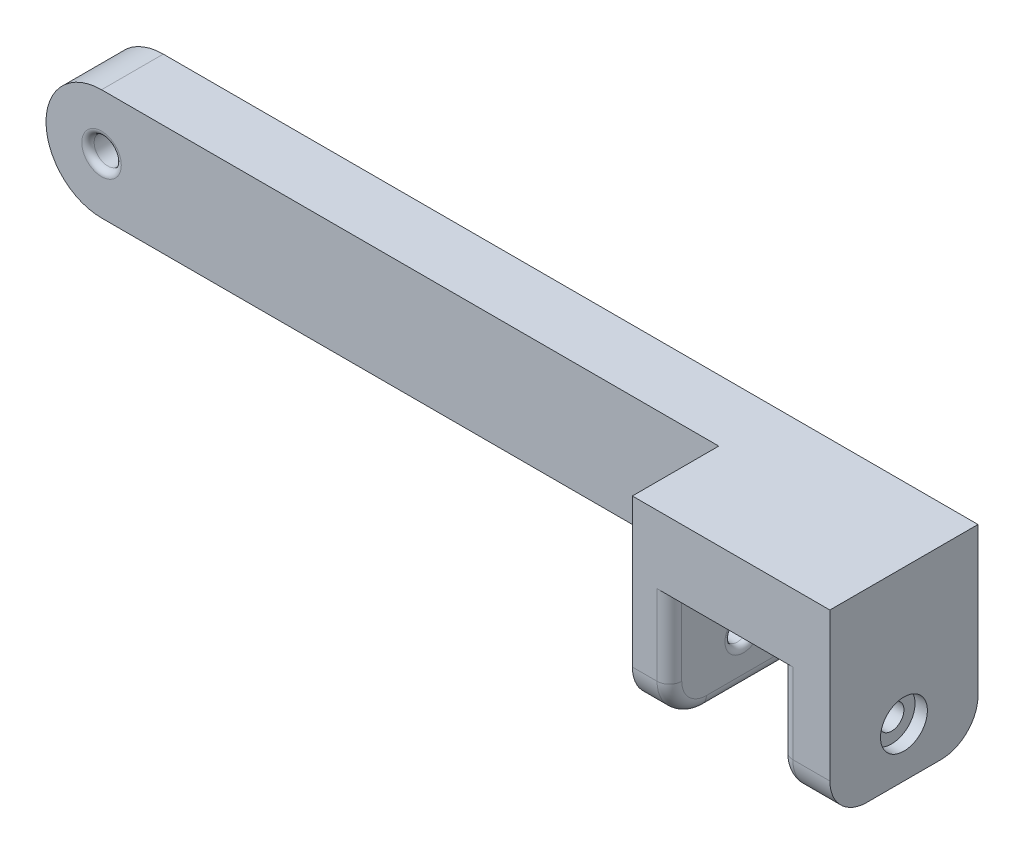
ISO-10303-21;
HEADER;
FILE_DESCRIPTION(('STEP AP214'),'2;1');
FILE_NAME('part.step','',(''),(''),'','','');
FILE_SCHEMA(('AUTOMOTIVE_DESIGN { 1 0 10303 214 1 1 1 1 }'));
ENDSEC;
DATA;
#1=APPLICATION_CONTEXT('core data for automotive mechanical design processes');
#2=APPLICATION_PROTOCOL_DEFINITION('international standard','automotive_design',2000,#1);
#3=PRODUCT_CONTEXT('',#1,'mechanical');
#4=PRODUCT('Part','Part','',(#3));
#5=PRODUCT_RELATED_PRODUCT_CATEGORY('part','',(#4));
#6=PRODUCT_DEFINITION_FORMATION('','',#4);
#7=PRODUCT_DEFINITION_CONTEXT('part definition',#1,'design');
#8=PRODUCT_DEFINITION('design','',#6,#7);
#9=PRODUCT_DEFINITION_SHAPE('','',#8);
#10=(LENGTH_UNIT() NAMED_UNIT(*) SI_UNIT(.MILLI.,.METRE.));
#11=(NAMED_UNIT(*) PLANE_ANGLE_UNIT() SI_UNIT($,.RADIAN.));
#12=(NAMED_UNIT(*) SI_UNIT($,.STERADIAN.) SOLID_ANGLE_UNIT());
#13=UNCERTAINTY_MEASURE_WITH_UNIT(LENGTH_MEASURE(1.E-05),#10,'distance_accuracy_value','');
#14=(GEOMETRIC_REPRESENTATION_CONTEXT(3) GLOBAL_UNCERTAINTY_ASSIGNED_CONTEXT((#13)) GLOBAL_UNIT_ASSIGNED_CONTEXT((#10,
#11,#12)) REPRESENTATION_CONTEXT('',''));
#15=CARTESIAN_POINT('',(0.,0.,0.));
#16=DIRECTION('',(0.,0.,1.));
#17=DIRECTION('',(1.,0.,0.));
#18=AXIS2_PLACEMENT_3D('',#15,#16,#17);
#19=CARTESIAN_POINT('',(62.,-10.5,-3.5));
#20=DIRECTION('',(1.,0.,0.));
#21=DIRECTION('',(0.,0.,-1.));
#22=AXIS2_PLACEMENT_3D('',#19,#20,#21);
#23=PLANE('',#22);
#24=CARTESIAN_POINT('',(62.,-6.5,6.));
#25=DIRECTION('',(1.,0.,0.));
#26=DIRECTION('',(0.,0.,-1.));
#27=AXIS2_PLACEMENT_3D('',#24,#25,#26);
#28=CIRCLE('',#27,1.);
#29=CARTESIAN_POINT('',(62.,-6.5,5.));
#30=VERTEX_POINT('',#29);
#31=EDGE_CURVE('E264',#30,#30,#28,.T.);
#32=ORIENTED_EDGE('',*,*,#31,.T.);
#33=EDGE_LOOP('',(#32));
#34=FACE_BOUND('',#33,.T.);
#35=CARTESIAN_POINT('',(62.,-7.5,9.));
#36=DIRECTION('',(1.,0.,0.));
#37=DIRECTION('',(0.,0.,-1.));
#38=AXIS2_PLACEMENT_3D('',#35,#36,#37);
#39=CIRCLE('',#38,2.);
#40=CARTESIAN_POINT('',(62.,-7.5,11.));
#41=VERTEX_POINT('',#40);
#42=CARTESIAN_POINT('',(62.,-9.5,9.));
#43=VERTEX_POINT('',#42);
#44=EDGE_CURVE('E333',#41,#43,#39,.T.);
#45=ORIENTED_EDGE('',*,*,#44,.F.);
#46=DIRECTION('',(0.,1.,0.));
#47=VECTOR('',#46,1.);
#48=CARTESIAN_POINT('',(62.,-1.,11.));
#49=LINE('',#48,#47);
#50=CARTESIAN_POINT('',(62.,-1.,11.));
#51=VERTEX_POINT('',#50);
#52=EDGE_CURVE('E271',#41,#51,#49,.T.);
#53=ORIENTED_EDGE('',*,*,#52,.T.);
#54=DIRECTION('',(0.,0.,-1.));
#55=VECTOR('',#54,1.);
#56=CARTESIAN_POINT('',(62.,-1.,-3.5));
#57=LINE('',#56,#55);
#58=CARTESIAN_POINT('',(62.,-1.,1.));
#59=VERTEX_POINT('',#58);
#60=EDGE_CURVE('E568',#51,#59,#57,.T.);
#61=ORIENTED_EDGE('',*,*,#60,.T.);
#62=DIRECTION('',(0.,1.,0.));
#63=VECTOR('',#62,1.);
#64=CARTESIAN_POINT('',(62.,-10.5,1.));
#65=LINE('',#64,#63);
#66=CARTESIAN_POINT('',(62.,-7.5,1.));
#67=VERTEX_POINT('',#66);
#68=EDGE_CURVE('E268',#59,#67,#65,.F.);
#69=ORIENTED_EDGE('',*,*,#68,.T.);
#70=CARTESIAN_POINT('',(62.,-7.5,3.));
#71=DIRECTION('',(1.,0.,0.));
#72=DIRECTION('',(0.,0.,-1.));
#73=AXIS2_PLACEMENT_3D('',#70,#71,#72);
#74=CIRCLE('',#73,2.);
#75=CARTESIAN_POINT('',(62.,-9.5,3.));
#76=VERTEX_POINT('',#75);
#77=EDGE_CURVE('E331',#76,#67,#74,.T.);
#78=ORIENTED_EDGE('',*,*,#77,.F.);
#79=DIRECTION('',(0.,0.,-1.));
#80=VECTOR('',#79,1.);
#81=CARTESIAN_POINT('',(62.,-9.5,-3.5));
#82=LINE('',#81,#80);
#83=EDGE_CURVE('E260',#76,#43,#82,.F.);
#84=ORIENTED_EDGE('',*,*,#83,.T.);
#85=EDGE_LOOP('',(#45,#53,#61,#69,#78,#84));
#86=FACE_BOUND('',#85,.T.);
#87=ADVANCED_FACE('F39',(#34,#86),#23,.F.);
#88=CARTESIAN_POINT('',(53.,-10.5,-3.5));
#89=DIRECTION('',(-1.,0.,0.));
#90=DIRECTION('',(0.,0.,1.));
#91=AXIS2_PLACEMENT_3D('',#88,#89,#90);
#92=PLANE('',#91);
#93=CARTESIAN_POINT('',(53.,-6.5,6.));
#94=DIRECTION('',(-1.,0.,0.));
#95=DIRECTION('',(0.,0.,1.));
#96=AXIS2_PLACEMENT_3D('',#93,#94,#95);
#97=CIRCLE('',#96,1.5);
#98=CARTESIAN_POINT('',(53.,-6.5,7.5));
#99=VERTEX_POINT('',#98);
#100=EDGE_CURVE('E245',#99,#99,#97,.T.);
#101=ORIENTED_EDGE('',*,*,#100,.T.);
#102=EDGE_LOOP('',(#101));
#103=FACE_BOUND('',#102,.T.);
#104=CARTESIAN_POINT('',(53.,-7.5,3.));
#105=DIRECTION('',(-1.,0.,0.));
#106=DIRECTION('',(0.,0.,1.));
#107=AXIS2_PLACEMENT_3D('',#104,#105,#106);
#108=CIRCLE('',#107,2.);
#109=CARTESIAN_POINT('',(53.,-7.5,1.));
#110=VERTEX_POINT('',#109);
#111=CARTESIAN_POINT('',(53.,-9.5,3.));
#112=VERTEX_POINT('',#111);
#113=EDGE_CURVE('E317',#110,#112,#108,.T.);
#114=ORIENTED_EDGE('',*,*,#113,.F.);
#115=DIRECTION('',(0.,-1.,0.));
#116=VECTOR('',#115,1.);
#117=CARTESIAN_POINT('',(53.,-10.5,1.));
#118=LINE('',#117,#116);
#119=CARTESIAN_POINT('',(53.,-1.,1.));
#120=VERTEX_POINT('',#119);
#121=EDGE_CURVE('E289',#110,#120,#118,.F.);
#122=ORIENTED_EDGE('',*,*,#121,.T.);
#123=DIRECTION('',(0.,0.,1.));
#124=VECTOR('',#123,1.);
#125=CARTESIAN_POINT('',(53.,-1.,-3.5));
#126=LINE('',#125,#124);
#127=CARTESIAN_POINT('',(53.,-1.,11.));
#128=VERTEX_POINT('',#127);
#129=EDGE_CURVE('E566',#120,#128,#126,.T.);
#130=ORIENTED_EDGE('',*,*,#129,.T.);
#131=DIRECTION('',(0.,1.,0.));
#132=VECTOR('',#131,1.);
#133=CARTESIAN_POINT('',(53.,-10.5,11.));
#134=LINE('',#133,#132);
#135=CARTESIAN_POINT('',(53.,-7.5,11.));
#136=VERTEX_POINT('',#135);
#137=EDGE_CURVE('E291',#128,#136,#134,.F.);
#138=ORIENTED_EDGE('',*,*,#137,.T.);
#139=CARTESIAN_POINT('',(53.,-7.5,9.));
#140=DIRECTION('',(-1.,0.,0.));
#141=DIRECTION('',(0.,0.,1.));
#142=AXIS2_PLACEMENT_3D('',#139,#140,#141);
#143=CIRCLE('',#142,2.);
#144=CARTESIAN_POINT('',(53.,-9.5,9.));
#145=VERTEX_POINT('',#144);
#146=EDGE_CURVE('E306',#145,#136,#143,.T.);
#147=ORIENTED_EDGE('',*,*,#146,.F.);
#148=DIRECTION('',(0.,0.,1.));
#149=VECTOR('',#148,1.);
#150=CARTESIAN_POINT('',(53.,-9.5,-3.5));
#151=LINE('',#150,#149);
#152=EDGE_CURVE('E286',#145,#112,#151,.F.);
#153=ORIENTED_EDGE('',*,*,#152,.T.);
#154=EDGE_LOOP('',(#114,#122,#130,#138,#147,#153));
#155=FACE_BOUND('',#154,.T.);
#156=ADVANCED_FACE('F375',(#103,#155),#92,.F.);
#157=CARTESIAN_POINT('',(50.,-6.5,6.));
#158=DIRECTION('',(1.,0.,0.));
#159=DIRECTION('',(0.,0.,-1.));
#160=AXIS2_PLACEMENT_3D('',#157,#158,#159);
#161=CYLINDRICAL_SURFACE('',#160,1.);
#162=CARTESIAN_POINT('',(52.5,-6.5,6.));
#163=DIRECTION('',(-1.,0.,0.));
#164=DIRECTION('',(0.,0.,1.));
#165=AXIS2_PLACEMENT_3D('',#162,#163,#164);
#166=CIRCLE('',#165,1.);
#167=CARTESIAN_POINT('',(52.5,-6.5,7.));
#168=VERTEX_POINT('',#167);
#169=EDGE_CURVE('E257',#168,#168,#166,.F.);
#170=ORIENTED_EDGE('',*,*,#169,.T.);
#171=EDGE_LOOP('',(#170));
#172=FACE_BOUND('',#171,.T.);
#173=CARTESIAN_POINT('',(50.5,-6.5,6.));
#174=DIRECTION('',(-1.,0.,0.));
#175=DIRECTION('',(0.,0.,1.));
#176=AXIS2_PLACEMENT_3D('',#173,#174,#175);
#177=CIRCLE('',#176,1.);
#178=CARTESIAN_POINT('',(50.5,-6.5,7.));
#179=VERTEX_POINT('',#178);
#180=EDGE_CURVE('E307',#179,#179,#177,.F.);
#181=ORIENTED_EDGE('',*,*,#180,.F.);
#182=EDGE_LOOP('',(#181));
#183=FACE_BOUND('',#182,.T.);
#184=ADVANCED_FACE('F381',(#172,#183),#161,.F.);
#185=ORIENTED_EDGE('',*,*,#31,.F.);
#186=EDGE_LOOP('',(#185));
#187=FACE_BOUND('',#186,.T.);
#188=CARTESIAN_POINT('',(65.,-6.5,6.));
#189=DIRECTION('',(1.,0.,0.));
#190=DIRECTION('',(0.,0.,-1.));
#191=AXIS2_PLACEMENT_3D('',#188,#189,#190);
#192=CIRCLE('',#191,1.);
#193=CARTESIAN_POINT('',(65.,-6.5,5.));
#194=VERTEX_POINT('',#193);
#195=EDGE_CURVE('E261',#194,#194,#192,.F.);
#196=ORIENTED_EDGE('',*,*,#195,.F.);
#197=EDGE_LOOP('',(#196));
#198=FACE_BOUND('',#197,.T.);
#199=ADVANCED_FACE('F501',(#187,#198),#161,.F.);
#200=CARTESIAN_POINT('',(0.,-10.5,0.));
#201=DIRECTION('',(0.,1.,0.));
#202=DIRECTION('',(0.,0.,1.));
#203=AXIS2_PLACEMENT_3D('',#200,#201,#202);
#204=PLANE('',#203);
#205=DIRECTION('',(0.,0.,-1.));
#206=VECTOR('',#205,1.);
#207=CARTESIAN_POINT('',(63.,-10.5,0.));
#208=LINE('',#207,#206);
#209=CARTESIAN_POINT('',(63.,-10.5,9.));
#210=VERTEX_POINT('',#209);
#211=CARTESIAN_POINT('',(63.,-10.5,3.));
#212=VERTEX_POINT('',#211);
#213=EDGE_CURVE('E283',#210,#212,#208,.T.);
#214=ORIENTED_EDGE('',*,*,#213,.T.);
#215=DIRECTION('',(-1.,0.,0.));
#216=VECTOR('',#215,1.);
#217=CARTESIAN_POINT('',(0.,-10.5,3.));
#218=LINE('',#217,#216);
#219=CARTESIAN_POINT('',(66.,-10.5,3.));
#220=VERTEX_POINT('',#219);
#221=EDGE_CURVE('E511',#212,#220,#218,.F.);
#222=ORIENTED_EDGE('',*,*,#221,.T.);
#223=DIRECTION('',(0.,0.,-1.));
#224=VECTOR('',#223,1.);
#225=CARTESIAN_POINT('',(66.,-10.5,0.));
#226=LINE('',#225,#224);
#227=CARTESIAN_POINT('',(66.,-10.5,9.));
#228=VERTEX_POINT('',#227);
#229=EDGE_CURVE('E563',#228,#220,#226,.T.);
#230=ORIENTED_EDGE('',*,*,#229,.F.);
#231=DIRECTION('',(1.,0.,0.));
#232=VECTOR('',#231,1.);
#233=CARTESIAN_POINT('',(63.,-10.5,9.));
#234=LINE('',#233,#232);
#235=EDGE_CURVE('E513',#228,#210,#234,.F.);
#236=ORIENTED_EDGE('',*,*,#235,.T.);
#237=EDGE_LOOP('',(#214,#222,#230,#236));
#238=FACE_BOUND('',#237,.T.);
#239=ADVANCED_FACE('F392',(#238),#204,.F.);
#240=CARTESIAN_POINT('',(0.,-4.5,5.));
#241=DIRECTION('',(0.,1.,0.));
#242=DIRECTION('',(0.,0.,1.));
#243=AXIS2_PLACEMENT_3D('',#240,#241,#242);
#244=PLANE('',#243);
#245=DIRECTION('',(1.,0.,0.));
#246=VECTOR('',#245,1.);
#247=CARTESIAN_POINT('',(0.,-4.5,0.));
#248=LINE('',#247,#246);
#249=CARTESIAN_POINT('',(0.,-4.5,0.));
#250=VERTEX_POINT('',#249);
#251=CARTESIAN_POINT('',(50.,-4.5,0.));
#252=VERTEX_POINT('',#251);
#253=EDGE_CURVE('E206',#250,#252,#248,.T.);
#254=ORIENTED_EDGE('',*,*,#253,.T.);
#255=DIRECTION('',(0.,0.,-1.));
#256=VECTOR('',#255,1.);
#257=CARTESIAN_POINT('',(50.,-4.5,5.));
#258=LINE('',#257,#256);
#259=CARTESIAN_POINT('',(50.,-4.5,5.));
#260=VERTEX_POINT('',#259);
#261=EDGE_CURVE('E238',#260,#252,#258,.T.);
#262=ORIENTED_EDGE('',*,*,#261,.F.);
#263=DIRECTION('',(1.,0.,0.));
#264=VECTOR('',#263,1.);
#265=CARTESIAN_POINT('',(0.,-4.5,5.));
#266=LINE('',#265,#264);
#267=CARTESIAN_POINT('',(0.,-4.5,5.));
#268=VERTEX_POINT('',#267);
#269=EDGE_CURVE('E226',#268,#260,#266,.T.);
#270=ORIENTED_EDGE('',*,*,#269,.F.);
#271=DIRECTION('',(0.,0.,-1.));
#272=VECTOR('',#271,1.);
#273=CARTESIAN_POINT('',(0.,-4.5,5.));
#274=LINE('',#273,#272);
#275=EDGE_CURVE('E230',#268,#250,#274,.T.);
#276=ORIENTED_EDGE('',*,*,#275,.T.);
#277=EDGE_LOOP('',(#254,#262,#270,#276));
#278=FACE_BOUND('',#277,.T.);
#279=ADVANCED_FACE('F353',(#278),#244,.F.);
#280=CARTESIAN_POINT('',(0.,4.5,5.));
#281=DIRECTION('',(0.,1.,0.));
#282=DIRECTION('',(0.,0.,1.));
#283=AXIS2_PLACEMENT_3D('',#280,#281,#282);
#284=PLANE('',#283);
#285=DIRECTION('',(1.,0.,0.));
#286=VECTOR('',#285,1.);
#287=CARTESIAN_POINT('',(0.,4.5,0.));
#288=LINE('',#287,#286);
#289=CARTESIAN_POINT('',(0.,4.5,0.));
#290=VERTEX_POINT('',#289);
#291=CARTESIAN_POINT('',(66.,4.5,0.));
#292=VERTEX_POINT('',#291);
#293=EDGE_CURVE('E201',#290,#292,#288,.T.);
#294=ORIENTED_EDGE('',*,*,#293,.F.);
#295=DIRECTION('',(0.,0.,-1.));
#296=VECTOR('',#295,1.);
#297=CARTESIAN_POINT('',(0.,4.5,5.));
#298=LINE('',#297,#296);
#299=CARTESIAN_POINT('',(0.,4.5,5.));
#300=VERTEX_POINT('',#299);
#301=EDGE_CURVE('E236',#300,#290,#298,.T.);
#302=ORIENTED_EDGE('',*,*,#301,.F.);
#303=DIRECTION('',(1.,0.,0.));
#304=VECTOR('',#303,1.);
#305=CARTESIAN_POINT('',(0.,4.5,5.));
#306=LINE('',#305,#304);
#307=CARTESIAN_POINT('',(50.,4.5,5.));
#308=VERTEX_POINT('',#307);
#309=EDGE_CURVE('E231',#300,#308,#306,.T.);
#310=ORIENTED_EDGE('',*,*,#309,.T.);
#311=DIRECTION('',(0.,0.,1.));
#312=VECTOR('',#311,1.);
#313=CARTESIAN_POINT('',(50.,4.5,0.));
#314=LINE('',#313,#312);
#315=CARTESIAN_POINT('',(50.,4.5,12.));
#316=VERTEX_POINT('',#315);
#317=EDGE_CURVE('E212',#308,#316,#314,.T.);
#318=ORIENTED_EDGE('',*,*,#317,.T.);
#319=DIRECTION('',(1.,0.,0.));
#320=VECTOR('',#319,1.);
#321=CARTESIAN_POINT('',(50.,4.5,12.));
#322=LINE('',#321,#320);
#323=CARTESIAN_POINT('',(66.,4.5,12.));
#324=VERTEX_POINT('',#323);
#325=EDGE_CURVE('E211',#316,#324,#322,.T.);
#326=ORIENTED_EDGE('',*,*,#325,.T.);
#327=DIRECTION('',(0.,0.,-1.));
#328=VECTOR('',#327,1.);
#329=CARTESIAN_POINT('',(66.,4.5,0.));
#330=LINE('',#329,#328);
#331=EDGE_CURVE('E190',#324,#292,#330,.T.);
#332=ORIENTED_EDGE('',*,*,#331,.T.);
#333=EDGE_LOOP('',(#294,#302,#310,#318,#326,#332));
#334=FACE_BOUND('',#333,.T.);
#335=ADVANCED_FACE('F208',(#334),#284,.T.);
#336=CARTESIAN_POINT('',(0.,0.,5.));
#337=DIRECTION('',(0.,0.,-1.));
#338=DIRECTION('',(-1.,0.,0.));
#339=AXIS2_PLACEMENT_3D('',#336,#337,#338);
#340=CYLINDRICAL_SURFACE('',#339,4.5);
#341=CARTESIAN_POINT('',(0.,0.,0.));
#342=DIRECTION('',(0.,0.,1.));
#343=DIRECTION('',(1.,0.,0.));
#344=AXIS2_PLACEMENT_3D('',#341,#342,#343);
#345=CIRCLE('',#344,4.5);
#346=EDGE_CURVE('E204',#290,#250,#345,.T.);
#347=ORIENTED_EDGE('',*,*,#346,.T.);
#348=ORIENTED_EDGE('',*,*,#275,.F.);
#349=CARTESIAN_POINT('',(0.,0.,5.));
#350=DIRECTION('',(0.,0.,1.));
#351=DIRECTION('',(1.,0.,0.));
#352=AXIS2_PLACEMENT_3D('',#349,#350,#351);
#353=CIRCLE('',#352,4.5);
#354=EDGE_CURVE('E229',#300,#268,#353,.T.);
#355=ORIENTED_EDGE('',*,*,#354,.F.);
#356=ORIENTED_EDGE('',*,*,#301,.T.);
#357=EDGE_LOOP('',(#347,#348,#355,#356));
#358=FACE_BOUND('',#357,.T.);
#359=ADVANCED_FACE('F363',(#358),#340,.T.);
#360=CARTESIAN_POINT('',(0.,0.,5.));
#361=DIRECTION('',(0.,0.,-1.));
#362=DIRECTION('',(-1.,0.,0.));
#363=AXIS2_PLACEMENT_3D('',#360,#361,#362);
#364=CYLINDRICAL_SURFACE('',#363,1.1);
#365=CARTESIAN_POINT('',(0.,0.,0.5));
#366=DIRECTION('',(0.,0.,1.));
#367=DIRECTION('',(1.,0.,0.));
#368=AXIS2_PLACEMENT_3D('',#365,#366,#367);
#369=CIRCLE('',#368,1.1);
#370=CARTESIAN_POINT('',(1.1,0.,0.5));
#371=VERTEX_POINT('',#370);
#372=EDGE_CURVE('E47',#371,#371,#369,.F.);
#373=ORIENTED_EDGE('',*,*,#372,.T.);
#374=EDGE_LOOP('',(#373));
#375=FACE_BOUND('',#374,.T.);
#376=CARTESIAN_POINT('',(0.,0.,4.5));
#377=DIRECTION('',(0.,0.,1.));
#378=DIRECTION('',(1.,0.,0.));
#379=AXIS2_PLACEMENT_3D('',#376,#377,#378);
#380=CIRCLE('',#379,1.1);
#381=CARTESIAN_POINT('',(1.1,0.,4.5));
#382=VERTEX_POINT('',#381);
#383=EDGE_CURVE('E413',#382,#382,#380,.T.);
#384=ORIENTED_EDGE('',*,*,#383,.T.);
#385=EDGE_LOOP('',(#384));
#386=FACE_BOUND('',#385,.T.);
#387=ADVANCED_FACE('F365',(#375,#386),#364,.F.);
#388=CARTESIAN_POINT('',(0.,0.,5.));
#389=DIRECTION('',(0.,0.,1.));
#390=DIRECTION('',(1.,0.,0.));
#391=AXIS2_PLACEMENT_3D('',#388,#389,#390);
#392=PLANE('',#391);
#393=CARTESIAN_POINT('',(0.,0.,5.));
#394=DIRECTION('',(0.,0.,1.));
#395=DIRECTION('',(1.,0.,0.));
#396=AXIS2_PLACEMENT_3D('',#393,#394,#395);
#397=CIRCLE('',#396,1.6);
#398=CARTESIAN_POINT('',(1.6,0.,5.));
#399=VERTEX_POINT('',#398);
#400=EDGE_CURVE('E11',#399,#399,#397,.F.);
#401=ORIENTED_EDGE('',*,*,#400,.T.);
#402=EDGE_LOOP('',(#401));
#403=FACE_BOUND('',#402,.T.);
#404=ORIENTED_EDGE('',*,*,#269,.T.);
#405=DIRECTION('',(0.,-1.,0.));
#406=VECTOR('',#405,1.);
#407=CARTESIAN_POINT('',(50.,0.,5.));
#408=LINE('',#407,#406);
#409=EDGE_CURVE('E228',#308,#260,#408,.T.);
#410=ORIENTED_EDGE('',*,*,#409,.F.);
#411=ORIENTED_EDGE('',*,*,#309,.F.);
#412=ORIENTED_EDGE('',*,*,#354,.T.);
#413=EDGE_LOOP('',(#404,#410,#411,#412));
#414=FACE_BOUND('',#413,.T.);
#415=ADVANCED_FACE('F360',(#403,#414),#392,.T.);
#416=CARTESIAN_POINT('',(0.,0.,0.));
#417=DIRECTION('',(0.,0.,1.));
#418=DIRECTION('',(1.,0.,0.));
#419=AXIS2_PLACEMENT_3D('',#416,#417,#418);
#420=PLANE('',#419);
#421=CARTESIAN_POINT('',(0.,0.,0.));
#422=DIRECTION('',(0.,0.,1.));
#423=DIRECTION('',(1.,0.,0.));
#424=AXIS2_PLACEMENT_3D('',#421,#422,#423);
#425=CIRCLE('',#424,1.6);
#426=CARTESIAN_POINT('',(1.6,0.,0.));
#427=VERTEX_POINT('',#426);
#428=EDGE_CURVE('E411',#427,#427,#425,.T.);
#429=ORIENTED_EDGE('',*,*,#428,.T.);
#430=EDGE_LOOP('',(#429));
#431=FACE_BOUND('',#430,.T.);
#432=DIRECTION('',(0.,1.,0.));
#433=VECTOR('',#432,1.);
#434=CARTESIAN_POINT('',(66.,-10.5,0.));
#435=LINE('',#434,#433);
#436=CARTESIAN_POINT('',(66.,-7.5,0.));
#437=VERTEX_POINT('',#436);
#438=EDGE_CURVE('E184',#437,#292,#435,.T.);
#439=ORIENTED_EDGE('',*,*,#438,.F.);
#440=DIRECTION('',(-1.,0.,0.));
#441=VECTOR('',#440,1.);
#442=CARTESIAN_POINT('',(0.,-7.5,0.));
#443=LINE('',#442,#441);
#444=CARTESIAN_POINT('',(63.,-7.5,0.));
#445=VERTEX_POINT('',#444);
#446=EDGE_CURVE('E542',#437,#445,#443,.T.);
#447=ORIENTED_EDGE('',*,*,#446,.T.);
#448=DIRECTION('',(0.,1.,0.));
#449=VECTOR('',#448,1.);
#450=CARTESIAN_POINT('',(63.,0.,0.));
#451=LINE('',#450,#449);
#452=CARTESIAN_POINT('',(63.,-1.,0.));
#453=VERTEX_POINT('',#452);
#454=EDGE_CURVE('E281',#445,#453,#451,.T.);
#455=ORIENTED_EDGE('',*,*,#454,.T.);
#456=DIRECTION('',(-1.,0.,0.));
#457=VECTOR('',#456,1.);
#458=CARTESIAN_POINT('',(0.,-1.,0.));
#459=LINE('',#458,#457);
#460=CARTESIAN_POINT('',(52.,-1.,0.));
#461=VERTEX_POINT('',#460);
#462=EDGE_CURVE('E213',#453,#461,#459,.T.);
#463=ORIENTED_EDGE('',*,*,#462,.T.);
#464=DIRECTION('',(0.,-1.,0.));
#465=VECTOR('',#464,1.);
#466=CARTESIAN_POINT('',(52.,0.,0.));
#467=LINE('',#466,#465);
#468=CARTESIAN_POINT('',(52.,-7.5,0.));
#469=VERTEX_POINT('',#468);
#470=EDGE_CURVE('E278',#461,#469,#467,.T.);
#471=ORIENTED_EDGE('',*,*,#470,.T.);
#472=DIRECTION('',(-1.,0.,0.));
#473=VECTOR('',#472,1.);
#474=CARTESIAN_POINT('',(0.,-7.5,0.));
#475=LINE('',#474,#473);
#476=CARTESIAN_POINT('',(50.,-7.5,0.));
#477=VERTEX_POINT('',#476);
#478=EDGE_CURVE('E342',#469,#477,#475,.T.);
#479=ORIENTED_EDGE('',*,*,#478,.T.);
#480=DIRECTION('',(0.,1.,0.));
#481=VECTOR('',#480,1.);
#482=CARTESIAN_POINT('',(50.,-10.5,0.));
#483=LINE('',#482,#481);
#484=EDGE_CURVE('E196',#477,#252,#483,.T.);
#485=ORIENTED_EDGE('',*,*,#484,.T.);
#486=ORIENTED_EDGE('',*,*,#253,.F.);
#487=ORIENTED_EDGE('',*,*,#346,.F.);
#488=ORIENTED_EDGE('',*,*,#293,.T.);
#489=EDGE_LOOP('',(#439,#447,#455,#463,#471,#479,#485,#486,#487,#488));
#490=FACE_BOUND('',#489,.T.);
#491=ADVANCED_FACE('F202',(#431,#490),#420,.F.);
#492=CARTESIAN_POINT('',(66.,-10.5,0.));
#493=DIRECTION('',(1.,0.,0.));
#494=DIRECTION('',(0.,0.,-1.));
#495=AXIS2_PLACEMENT_3D('',#492,#493,#494);
#496=PLANE('',#495);
#497=CARTESIAN_POINT('',(66.,-6.5,6.));
#498=DIRECTION('',(1.,0.,0.));
#499=DIRECTION('',(0.,0.,-1.));
#500=AXIS2_PLACEMENT_3D('',#497,#498,#499);
#501=CIRCLE('',#500,1.9);
#502=CARTESIAN_POINT('',(66.,-6.5,4.1));
#503=VERTEX_POINT('',#502);
#504=EDGE_CURVE('E314',#503,#503,#501,.T.);
#505=ORIENTED_EDGE('',*,*,#504,.F.);
#506=EDGE_LOOP('',(#505));
#507=FACE_BOUND('',#506,.T.);
#508=ORIENTED_EDGE('',*,*,#229,.T.);
#509=CARTESIAN_POINT('',(66.,-7.5,3.));
#510=DIRECTION('',(1.,0.,0.));
#511=DIRECTION('',(0.,0.,-1.));
#512=AXIS2_PLACEMENT_3D('',#509,#510,#511);
#513=CIRCLE('',#512,3.);
#514=EDGE_CURVE('E193',#220,#437,#513,.T.);
#515=ORIENTED_EDGE('',*,*,#514,.T.);
#516=ORIENTED_EDGE('',*,*,#438,.T.);
#517=ORIENTED_EDGE('',*,*,#331,.F.);
#518=DIRECTION('',(0.,1.,0.));
#519=VECTOR('',#518,1.);
#520=CARTESIAN_POINT('',(66.,-10.5,12.));
#521=LINE('',#520,#519);
#522=CARTESIAN_POINT('',(66.,-7.5,12.));
#523=VERTEX_POINT('',#522);
#524=EDGE_CURVE('E348',#523,#324,#521,.T.);
#525=ORIENTED_EDGE('',*,*,#524,.F.);
#526=CARTESIAN_POINT('',(66.,-7.5,9.));
#527=DIRECTION('',(1.,0.,0.));
#528=DIRECTION('',(0.,0.,-1.));
#529=AXIS2_PLACEMENT_3D('',#526,#527,#528);
#530=CIRCLE('',#529,3.);
#531=EDGE_CURVE('E518',#523,#228,#530,.T.);
#532=ORIENTED_EDGE('',*,*,#531,.T.);
#533=EDGE_LOOP('',(#508,#515,#516,#517,#525,#532));
#534=FACE_BOUND('',#533,.T.);
#535=ADVANCED_FACE('F187',(#507,#534),#496,.T.);
#536=CARTESIAN_POINT('',(50.,-10.5,12.));
#537=DIRECTION('',(0.,0.,1.));
#538=DIRECTION('',(1.,0.,0.));
#539=AXIS2_PLACEMENT_3D('',#536,#537,#538);
#540=PLANE('',#539);
#541=DIRECTION('',(0.,1.,0.));
#542=VECTOR('',#541,1.);
#543=CARTESIAN_POINT('',(63.,-10.5,12.));
#544=LINE('',#543,#542);
#545=CARTESIAN_POINT('',(63.,-1.,12.));
#546=VERTEX_POINT('',#545);
#547=CARTESIAN_POINT('',(63.,-7.5,12.));
#548=VERTEX_POINT('',#547);
#549=EDGE_CURVE('E275',#546,#548,#544,.F.);
#550=ORIENTED_EDGE('',*,*,#549,.T.);
#551=DIRECTION('',(1.,0.,0.));
#552=VECTOR('',#551,1.);
#553=CARTESIAN_POINT('',(66.,-7.5,12.));
#554=LINE('',#553,#552);
#555=EDGE_CURVE('E536',#548,#523,#554,.T.);
#556=ORIENTED_EDGE('',*,*,#555,.T.);
#557=ORIENTED_EDGE('',*,*,#524,.T.);
#558=ORIENTED_EDGE('',*,*,#325,.F.);
#559=DIRECTION('',(0.,1.,0.));
#560=VECTOR('',#559,1.);
#561=CARTESIAN_POINT('',(50.,-10.5,12.));
#562=LINE('',#561,#560);
#563=CARTESIAN_POINT('',(50.,-7.5,12.));
#564=VERTEX_POINT('',#563);
#565=EDGE_CURVE('E344',#564,#316,#562,.T.);
#566=ORIENTED_EDGE('',*,*,#565,.F.);
#567=DIRECTION('',(1.,0.,0.));
#568=VECTOR('',#567,1.);
#569=CARTESIAN_POINT('',(52.,-7.5,12.));
#570=LINE('',#569,#568);
#571=CARTESIAN_POINT('',(52.,-7.5,12.));
#572=VERTEX_POINT('',#571);
#573=EDGE_CURVE('E538',#564,#572,#570,.T.);
#574=ORIENTED_EDGE('',*,*,#573,.T.);
#575=DIRECTION('',(0.,1.,0.));
#576=VECTOR('',#575,1.);
#577=CARTESIAN_POINT('',(52.,-1.,12.));
#578=LINE('',#577,#576);
#579=CARTESIAN_POINT('',(52.,-1.,12.));
#580=VERTEX_POINT('',#579);
#581=EDGE_CURVE('E273',#572,#580,#578,.T.);
#582=ORIENTED_EDGE('',*,*,#581,.T.);
#583=DIRECTION('',(1.,0.,0.));
#584=VECTOR('',#583,1.);
#585=CARTESIAN_POINT('',(53.,-1.,12.));
#586=LINE('',#585,#584);
#587=EDGE_CURVE('E216',#580,#546,#586,.T.);
#588=ORIENTED_EDGE('',*,*,#587,.T.);
#589=EDGE_LOOP('',(#550,#556,#557,#558,#566,#574,#582,#588));
#590=FACE_BOUND('',#589,.T.);
#591=ADVANCED_FACE('F393',(#590),#540,.T.);
#592=CARTESIAN_POINT('',(50.,-10.5,0.));
#593=DIRECTION('',(-1.,0.,0.));
#594=DIRECTION('',(0.,0.,1.));
#595=AXIS2_PLACEMENT_3D('',#592,#593,#594);
#596=PLANE('',#595);
#597=CARTESIAN_POINT('',(50.,-6.5,6.));
#598=DIRECTION('',(-1.,0.,0.));
#599=DIRECTION('',(0.,0.,1.));
#600=AXIS2_PLACEMENT_3D('',#597,#598,#599);
#601=CIRCLE('',#600,2.);
#602=CARTESIAN_POINT('',(50.,-6.5,8.));
#603=VERTEX_POINT('',#602);
#604=EDGE_CURVE('E310',#603,#603,#601,.F.);
#605=ORIENTED_EDGE('',*,*,#604,.T.);
#606=EDGE_LOOP('',(#605));
#607=FACE_BOUND('',#606,.T.);
#608=DIRECTION('',(0.,0.,1.));
#609=VECTOR('',#608,1.);
#610=CARTESIAN_POINT('',(50.,-10.5,0.));
#611=LINE('',#610,#609);
#612=CARTESIAN_POINT('',(50.,-10.5,3.));
#613=VERTEX_POINT('',#612);
#614=CARTESIAN_POINT('',(50.,-10.5,9.));
#615=VERTEX_POINT('',#614);
#616=EDGE_CURVE('E197',#613,#615,#611,.T.);
#617=ORIENTED_EDGE('',*,*,#616,.T.);
#618=CARTESIAN_POINT('',(50.,-7.5,9.));
#619=DIRECTION('',(-1.,0.,0.));
#620=DIRECTION('',(0.,0.,1.));
#621=AXIS2_PLACEMENT_3D('',#618,#619,#620);
#622=CIRCLE('',#621,3.);
#623=EDGE_CURVE('E414',#615,#564,#622,.T.);
#624=ORIENTED_EDGE('',*,*,#623,.T.);
#625=ORIENTED_EDGE('',*,*,#565,.T.);
#626=ORIENTED_EDGE('',*,*,#317,.F.);
#627=ORIENTED_EDGE('',*,*,#409,.T.);
#628=ORIENTED_EDGE('',*,*,#261,.T.);
#629=ORIENTED_EDGE('',*,*,#484,.F.);
#630=CARTESIAN_POINT('',(50.,-7.5,3.));
#631=DIRECTION('',(-1.,0.,0.));
#632=DIRECTION('',(0.,0.,1.));
#633=AXIS2_PLACEMENT_3D('',#630,#631,#632);
#634=CIRCLE('',#633,3.);
#635=EDGE_CURVE('E61',#477,#613,#634,.T.);
#636=ORIENTED_EDGE('',*,*,#635,.T.);
#637=EDGE_LOOP('',(#617,#624,#625,#626,#627,#628,#629,#636));
#638=FACE_BOUND('',#637,.T.);
#639=ADVANCED_FACE('F356',(#607,#638),#596,.T.);
#640=DIRECTION('',(0.,0.,1.));
#641=VECTOR('',#640,1.);
#642=CARTESIAN_POINT('',(52.,-10.5,0.));
#643=LINE('',#642,#641);
#644=CARTESIAN_POINT('',(52.,-10.5,3.));
#645=VERTEX_POINT('',#644);
#646=CARTESIAN_POINT('',(52.,-10.5,9.));
#647=VERTEX_POINT('',#646);
#648=EDGE_CURVE('E294',#645,#647,#643,.T.);
#649=ORIENTED_EDGE('',*,*,#648,.T.);
#650=DIRECTION('',(1.,0.,0.));
#651=VECTOR('',#650,1.);
#652=CARTESIAN_POINT('',(50.,-10.5,9.));
#653=LINE('',#652,#651);
#654=EDGE_CURVE('E54',#647,#615,#653,.F.);
#655=ORIENTED_EDGE('',*,*,#654,.T.);
#656=ORIENTED_EDGE('',*,*,#616,.F.);
#657=DIRECTION('',(-1.,0.,0.));
#658=VECTOR('',#657,1.);
#659=CARTESIAN_POINT('',(0.,-10.5,3.));
#660=LINE('',#659,#658);
#661=EDGE_CURVE('E534',#613,#645,#660,.F.);
#662=ORIENTED_EDGE('',*,*,#661,.T.);
#663=EDGE_LOOP('',(#649,#655,#656,#662));
#664=FACE_BOUND('',#663,.T.);
#665=ADVANCED_FACE('F388',(#664),#204,.F.);
#666=CARTESIAN_POINT('',(0.,-1.,0.));
#667=DIRECTION('',(0.,1.,0.));
#668=DIRECTION('',(0.,0.,1.));
#669=AXIS2_PLACEMENT_3D('',#666,#667,#668);
#670=PLANE('',#669);
#671=ORIENTED_EDGE('',*,*,#60,.F.);
#672=CARTESIAN_POINT('',(63.,-1.,11.));
#673=DIRECTION('',(0.,1.,0.));
#674=DIRECTION('',(0.,0.,1.));
#675=AXIS2_PLACEMENT_3D('',#672,#673,#674);
#676=CIRCLE('',#675,1.);
#677=EDGE_CURVE('E296',#51,#546,#676,.T.);
#678=ORIENTED_EDGE('',*,*,#677,.T.);
#679=ORIENTED_EDGE('',*,*,#587,.F.);
#680=CARTESIAN_POINT('',(52.,-1.,11.));
#681=DIRECTION('',(0.,1.,0.));
#682=DIRECTION('',(0.,0.,1.));
#683=AXIS2_PLACEMENT_3D('',#680,#681,#682);
#684=CIRCLE('',#683,1.);
#685=EDGE_CURVE('E301',#580,#128,#684,.T.);
#686=ORIENTED_EDGE('',*,*,#685,.T.);
#687=ORIENTED_EDGE('',*,*,#129,.F.);
#688=CARTESIAN_POINT('',(52.,-1.,1.));
#689=DIRECTION('',(0.,1.,0.));
#690=DIRECTION('',(0.,0.,1.));
#691=AXIS2_PLACEMENT_3D('',#688,#689,#690);
#692=CIRCLE('',#691,1.);
#693=EDGE_CURVE('E303',#120,#461,#692,.T.);
#694=ORIENTED_EDGE('',*,*,#693,.T.);
#695=ORIENTED_EDGE('',*,*,#462,.F.);
#696=CARTESIAN_POINT('',(63.,-1.,1.));
#697=DIRECTION('',(0.,1.,0.));
#698=DIRECTION('',(0.,0.,1.));
#699=AXIS2_PLACEMENT_3D('',#696,#697,#698);
#700=CIRCLE('',#699,1.);
#701=EDGE_CURVE('E299',#453,#59,#700,.T.);
#702=ORIENTED_EDGE('',*,*,#701,.T.);
#703=EDGE_LOOP('',(#671,#678,#679,#686,#687,#694,#695,#702));
#704=FACE_BOUND('',#703,.T.);
#705=ADVANCED_FACE('F391',(#704),#670,.F.);
#706=CARTESIAN_POINT('',(52.5,-6.5,6.));
#707=DIRECTION('',(-1.,0.,0.));
#708=DIRECTION('',(0.,0.,1.));
#709=AXIS2_PLACEMENT_3D('',#706,#707,#708);
#710=TOROIDAL_SURFACE('',#709,1.5,0.5);
#711=ORIENTED_EDGE('',*,*,#169,.F.);
#712=EDGE_LOOP('',(#711));
#713=FACE_BOUND('',#712,.T.);
#714=ORIENTED_EDGE('',*,*,#100,.F.);
#715=EDGE_LOOP('',(#714));
#716=FACE_BOUND('',#715,.T.);
#717=ADVANCED_FACE('F492',(#713,#716),#710,.T.);
#718=CARTESIAN_POINT('',(65.,-6.5,6.));
#719=DIRECTION('',(1.,0.,0.));
#720=DIRECTION('',(0.,0.,-1.));
#721=AXIS2_PLACEMENT_3D('',#718,#719,#720);
#722=PLANE('',#721);
#723=CARTESIAN_POINT('',(65.,-6.5,6.));
#724=DIRECTION('',(1.,0.,0.));
#725=DIRECTION('',(0.,0.,-1.));
#726=AXIS2_PLACEMENT_3D('',#723,#724,#725);
#727=CIRCLE('',#726,1.9);
#728=CARTESIAN_POINT('',(65.,-6.5,4.1));
#729=VERTEX_POINT('',#728);
#730=EDGE_CURVE('E265',#729,#729,#727,.T.);
#731=ORIENTED_EDGE('',*,*,#730,.T.);
#732=EDGE_LOOP('',(#731));
#733=FACE_BOUND('',#732,.T.);
#734=ORIENTED_EDGE('',*,*,#195,.T.);
#735=EDGE_LOOP('',(#734));
#736=FACE_BOUND('',#735,.T.);
#737=ADVANCED_FACE('F495',(#733,#736),#722,.T.);
#738=CARTESIAN_POINT('',(65.,-6.5,6.));
#739=DIRECTION('',(1.,0.,0.));
#740=DIRECTION('',(0.,0.,-1.));
#741=AXIS2_PLACEMENT_3D('',#738,#739,#740);
#742=CYLINDRICAL_SURFACE('',#741,1.9);
#743=ORIENTED_EDGE('',*,*,#730,.F.);
#744=EDGE_LOOP('',(#743));
#745=FACE_BOUND('',#744,.T.);
#746=ORIENTED_EDGE('',*,*,#504,.T.);
#747=EDGE_LOOP('',(#746));
#748=FACE_BOUND('',#747,.T.);
#749=ADVANCED_FACE('F484',(#745,#748),#742,.F.);
#750=CARTESIAN_POINT('',(63.,0.,1.));
#751=DIRECTION('',(0.,1.,0.));
#752=DIRECTION('',(0.,0.,1.));
#753=AXIS2_PLACEMENT_3D('',#750,#751,#752);
#754=CYLINDRICAL_SURFACE('',#753,1.);
#755=ORIENTED_EDGE('',*,*,#454,.F.);
#756=CARTESIAN_POINT('',(63.,-7.5,1.));
#757=DIRECTION('',(0.,1.,0.));
#758=DIRECTION('',(0.,0.,1.));
#759=AXIS2_PLACEMENT_3D('',#756,#757,#758);
#760=CIRCLE('',#759,1.);
#761=EDGE_CURVE('E335',#445,#67,#760,.T.);
#762=ORIENTED_EDGE('',*,*,#761,.T.);
#763=ORIENTED_EDGE('',*,*,#68,.F.);
#764=ORIENTED_EDGE('',*,*,#701,.F.);
#765=EDGE_LOOP('',(#755,#762,#763,#764));
#766=FACE_BOUND('',#765,.T.);
#767=ADVANCED_FACE('F480',(#766),#754,.T.);
#768=CARTESIAN_POINT('',(63.,-9.5,0.));
#769=DIRECTION('',(0.,0.,-1.));
#770=DIRECTION('',(-1.,0.,0.));
#771=AXIS2_PLACEMENT_3D('',#768,#769,#770);
#772=CYLINDRICAL_SURFACE('',#771,1.);
#773=ORIENTED_EDGE('',*,*,#213,.F.);
#774=CARTESIAN_POINT('',(63.,-9.5,9.));
#775=DIRECTION('',(0.,0.,-1.));
#776=DIRECTION('',(-1.,0.,0.));
#777=AXIS2_PLACEMENT_3D('',#774,#775,#776);
#778=CIRCLE('',#777,1.);
#779=EDGE_CURVE('E328',#210,#43,#778,.T.);
#780=ORIENTED_EDGE('',*,*,#779,.T.);
#781=ORIENTED_EDGE('',*,*,#83,.F.);
#782=CARTESIAN_POINT('',(63.,-9.5,3.));
#783=DIRECTION('',(0.,0.,1.));
#784=DIRECTION('',(1.,0.,0.));
#785=AXIS2_PLACEMENT_3D('',#782,#783,#784);
#786=CIRCLE('',#785,1.);
#787=EDGE_CURVE('E326',#76,#212,#786,.T.);
#788=ORIENTED_EDGE('',*,*,#787,.T.);
#789=EDGE_LOOP('',(#773,#780,#781,#788));
#790=FACE_BOUND('',#789,.T.);
#791=ADVANCED_FACE('F483',(#790),#772,.T.);
#792=CARTESIAN_POINT('',(63.,-10.5,11.));
#793=DIRECTION('',(0.,-1.,0.));
#794=DIRECTION('',(0.,0.,-1.));
#795=AXIS2_PLACEMENT_3D('',#792,#793,#794);
#796=CYLINDRICAL_SURFACE('',#795,1.);
#797=ORIENTED_EDGE('',*,*,#52,.F.);
#798=CARTESIAN_POINT('',(63.,-7.5,11.));
#799=DIRECTION('',(0.,1.,0.));
#800=DIRECTION('',(0.,0.,1.));
#801=AXIS2_PLACEMENT_3D('',#798,#799,#800);
#802=CIRCLE('',#801,1.);
#803=EDGE_CURVE('E338',#41,#548,#802,.T.);
#804=ORIENTED_EDGE('',*,*,#803,.T.);
#805=ORIENTED_EDGE('',*,*,#549,.F.);
#806=ORIENTED_EDGE('',*,*,#677,.F.);
#807=EDGE_LOOP('',(#797,#804,#805,#806));
#808=FACE_BOUND('',#807,.T.);
#809=ADVANCED_FACE('F470',(#808),#796,.T.);
#810=CARTESIAN_POINT('',(52.,0.,1.));
#811=DIRECTION('',(0.,-1.,0.));
#812=DIRECTION('',(0.,0.,-1.));
#813=AXIS2_PLACEMENT_3D('',#810,#811,#812);
#814=CYLINDRICAL_SURFACE('',#813,1.);
#815=ORIENTED_EDGE('',*,*,#121,.F.);
#816=CARTESIAN_POINT('',(52.,-7.5,1.));
#817=DIRECTION('',(0.,1.,0.));
#818=DIRECTION('',(0.,0.,1.));
#819=AXIS2_PLACEMENT_3D('',#816,#817,#818);
#820=CIRCLE('',#819,1.);
#821=EDGE_CURVE('E340',#110,#469,#820,.T.);
#822=ORIENTED_EDGE('',*,*,#821,.T.);
#823=ORIENTED_EDGE('',*,*,#470,.F.);
#824=ORIENTED_EDGE('',*,*,#693,.F.);
#825=EDGE_LOOP('',(#815,#822,#823,#824));
#826=FACE_BOUND('',#825,.T.);
#827=ADVANCED_FACE('F466',(#826),#814,.T.);
#828=CARTESIAN_POINT('',(52.,-9.5,0.));
#829=DIRECTION('',(0.,0.,1.));
#830=DIRECTION('',(1.,0.,0.));
#831=AXIS2_PLACEMENT_3D('',#828,#829,#830);
#832=CYLINDRICAL_SURFACE('',#831,1.);
#833=ORIENTED_EDGE('',*,*,#648,.F.);
#834=CARTESIAN_POINT('',(52.,-9.5,3.));
#835=DIRECTION('',(0.,0.,1.));
#836=DIRECTION('',(1.,0.,0.));
#837=AXIS2_PLACEMENT_3D('',#834,#835,#836);
#838=CIRCLE('',#837,1.);
#839=EDGE_CURVE('E322',#645,#112,#838,.T.);
#840=ORIENTED_EDGE('',*,*,#839,.T.);
#841=ORIENTED_EDGE('',*,*,#152,.F.);
#842=CARTESIAN_POINT('',(52.,-9.5,9.));
#843=DIRECTION('',(0.,0.,-1.));
#844=DIRECTION('',(-1.,0.,0.));
#845=AXIS2_PLACEMENT_3D('',#842,#843,#844);
#846=CIRCLE('',#845,1.);
#847=EDGE_CURVE('E320',#145,#647,#846,.T.);
#848=ORIENTED_EDGE('',*,*,#847,.T.);
#849=EDGE_LOOP('',(#833,#840,#841,#848));
#850=FACE_BOUND('',#849,.T.);
#851=ADVANCED_FACE('F469',(#850),#832,.T.);
#852=CARTESIAN_POINT('',(52.,-10.5,11.));
#853=DIRECTION('',(0.,-1.,0.));
#854=DIRECTION('',(0.,0.,-1.));
#855=AXIS2_PLACEMENT_3D('',#852,#853,#854);
#856=CYLINDRICAL_SURFACE('',#855,1.);
#857=ORIENTED_EDGE('',*,*,#581,.F.);
#858=CARTESIAN_POINT('',(52.,-7.5,11.));
#859=DIRECTION('',(0.,1.,0.));
#860=DIRECTION('',(0.,0.,1.));
#861=AXIS2_PLACEMENT_3D('',#858,#859,#860);
#862=CIRCLE('',#861,1.);
#863=EDGE_CURVE('E324',#572,#136,#862,.T.);
#864=ORIENTED_EDGE('',*,*,#863,.T.);
#865=ORIENTED_EDGE('',*,*,#137,.F.);
#866=ORIENTED_EDGE('',*,*,#685,.F.);
#867=EDGE_LOOP('',(#857,#864,#865,#866));
#868=FACE_BOUND('',#867,.T.);
#869=ADVANCED_FACE('F474',(#868),#856,.T.);
#870=CARTESIAN_POINT('',(50.5,-6.5,6.));
#871=DIRECTION('',(-1.,0.,0.));
#872=DIRECTION('',(0.,0.,1.));
#873=AXIS2_PLACEMENT_3D('',#870,#871,#872);
#874=PLANE('',#873);
#875=CARTESIAN_POINT('',(50.5,-6.5,6.));
#876=DIRECTION('',(-1.,0.,0.));
#877=DIRECTION('',(0.,0.,1.));
#878=AXIS2_PLACEMENT_3D('',#875,#876,#877);
#879=CIRCLE('',#878,2.);
#880=CARTESIAN_POINT('',(50.5,-6.5,8.));
#881=VERTEX_POINT('',#880);
#882=EDGE_CURVE('E311',#881,#881,#879,.T.);
#883=ORIENTED_EDGE('',*,*,#882,.T.);
#884=EDGE_LOOP('',(#883));
#885=FACE_BOUND('',#884,.T.);
#886=ORIENTED_EDGE('',*,*,#180,.T.);
#887=EDGE_LOOP('',(#886));
#888=FACE_BOUND('',#887,.T.);
#889=ADVANCED_FACE('F478',(#885,#888),#874,.T.);
#890=CARTESIAN_POINT('',(45.,-6.5,6.));
#891=DIRECTION('',(1.,0.,0.));
#892=DIRECTION('',(0.,0.,-1.));
#893=AXIS2_PLACEMENT_3D('',#890,#891,#892);
#894=CYLINDRICAL_SURFACE('',#893,2.);
#895=ORIENTED_EDGE('',*,*,#604,.F.);
#896=EDGE_LOOP('',(#895));
#897=FACE_BOUND('',#896,.T.);
#898=ORIENTED_EDGE('',*,*,#882,.F.);
#899=EDGE_LOOP('',(#898));
#900=FACE_BOUND('',#899,.T.);
#901=ADVANCED_FACE('F461',(#897,#900),#894,.F.);
#902=CARTESIAN_POINT('',(0.,-7.5,3.));
#903=DIRECTION('',(-1.,0.,0.));
#904=DIRECTION('',(0.,0.,1.));
#905=AXIS2_PLACEMENT_3D('',#902,#903,#904);
#906=CYLINDRICAL_SURFACE('',#905,3.);
#907=ORIENTED_EDGE('',*,*,#635,.F.);
#908=ORIENTED_EDGE('',*,*,#478,.F.);
#909=CARTESIAN_POINT('',(52.,-7.5,3.));
#910=DIRECTION('',(-1.,0.,0.));
#911=DIRECTION('',(0.,0.,1.));
#912=AXIS2_PLACEMENT_3D('',#909,#910,#911);
#913=CIRCLE('',#912,3.);
#914=EDGE_CURVE('E527',#645,#469,#913,.F.);
#915=ORIENTED_EDGE('',*,*,#914,.F.);
#916=ORIENTED_EDGE('',*,*,#661,.F.);
#917=EDGE_LOOP('',(#907,#908,#915,#916));
#918=FACE_BOUND('',#917,.T.);
#919=ADVANCED_FACE('F458',(#918),#906,.T.);
#920=CARTESIAN_POINT('',(52.,-7.5,3.));
#921=DIRECTION('',(-1.,0.,0.));
#922=DIRECTION('',(0.,0.,1.));
#923=AXIS2_PLACEMENT_3D('',#920,#921,#922);
#924=TOROIDAL_SURFACE('',#923,2.,1.);
#925=ORIENTED_EDGE('',*,*,#821,.F.);
#926=ORIENTED_EDGE('',*,*,#113,.T.);
#927=ORIENTED_EDGE('',*,*,#839,.F.);
#928=ORIENTED_EDGE('',*,*,#914,.T.);
#929=EDGE_LOOP('',(#925,#926,#927,#928));
#930=FACE_BOUND('',#929,.T.);
#931=ADVANCED_FACE('F453',(#930),#924,.T.);
#932=CARTESIAN_POINT('',(50.,-7.5,9.));
#933=DIRECTION('',(-1.,0.,0.));
#934=DIRECTION('',(0.,0.,1.));
#935=AXIS2_PLACEMENT_3D('',#932,#933,#934);
#936=CYLINDRICAL_SURFACE('',#935,3.);
#937=ORIENTED_EDGE('',*,*,#623,.F.);
#938=ORIENTED_EDGE('',*,*,#654,.F.);
#939=CARTESIAN_POINT('',(52.,-7.5,9.));
#940=DIRECTION('',(-1.,0.,0.));
#941=DIRECTION('',(0.,0.,1.));
#942=AXIS2_PLACEMENT_3D('',#939,#940,#941);
#943=CIRCLE('',#942,3.);
#944=EDGE_CURVE('E523',#572,#647,#943,.F.);
#945=ORIENTED_EDGE('',*,*,#944,.F.);
#946=ORIENTED_EDGE('',*,*,#573,.F.);
#947=EDGE_LOOP('',(#937,#938,#945,#946));
#948=FACE_BOUND('',#947,.T.);
#949=ADVANCED_FACE('F450',(#948),#936,.T.);
#950=CARTESIAN_POINT('',(52.,-7.5,9.));
#951=DIRECTION('',(-1.,0.,0.));
#952=DIRECTION('',(0.,0.,1.));
#953=AXIS2_PLACEMENT_3D('',#950,#951,#952);
#954=TOROIDAL_SURFACE('',#953,2.,1.);
#955=ORIENTED_EDGE('',*,*,#847,.F.);
#956=ORIENTED_EDGE('',*,*,#146,.T.);
#957=ORIENTED_EDGE('',*,*,#863,.F.);
#958=ORIENTED_EDGE('',*,*,#944,.T.);
#959=EDGE_LOOP('',(#955,#956,#957,#958));
#960=FACE_BOUND('',#959,.T.);
#961=ADVANCED_FACE('F445',(#960),#954,.T.);
#962=CARTESIAN_POINT('',(50.,-7.5,9.));
#963=DIRECTION('',(-1.,0.,0.));
#964=DIRECTION('',(0.,0.,1.));
#965=AXIS2_PLACEMENT_3D('',#962,#963,#964);
#966=CYLINDRICAL_SURFACE('',#965,3.);
#967=ORIENTED_EDGE('',*,*,#531,.F.);
#968=ORIENTED_EDGE('',*,*,#555,.F.);
#969=CARTESIAN_POINT('',(63.,-7.5,9.));
#970=DIRECTION('',(1.,0.,0.));
#971=DIRECTION('',(0.,0.,-1.));
#972=AXIS2_PLACEMENT_3D('',#969,#970,#971);
#973=CIRCLE('',#972,3.);
#974=EDGE_CURVE('E521',#210,#548,#973,.F.);
#975=ORIENTED_EDGE('',*,*,#974,.F.);
#976=ORIENTED_EDGE('',*,*,#235,.F.);
#977=EDGE_LOOP('',(#967,#968,#975,#976));
#978=FACE_BOUND('',#977,.T.);
#979=ADVANCED_FACE('F442',(#978),#966,.T.);
#980=CARTESIAN_POINT('',(63.,-7.5,9.));
#981=DIRECTION('',(1.,0.,0.));
#982=DIRECTION('',(0.,0.,-1.));
#983=AXIS2_PLACEMENT_3D('',#980,#981,#982);
#984=TOROIDAL_SURFACE('',#983,2.,1.);
#985=ORIENTED_EDGE('',*,*,#779,.F.);
#986=ORIENTED_EDGE('',*,*,#974,.T.);
#987=ORIENTED_EDGE('',*,*,#803,.F.);
#988=ORIENTED_EDGE('',*,*,#44,.T.);
#989=EDGE_LOOP('',(#985,#986,#987,#988));
#990=FACE_BOUND('',#989,.T.);
#991=ADVANCED_FACE('F439',(#990),#984,.T.);
#992=CARTESIAN_POINT('',(0.,-7.5,3.));
#993=DIRECTION('',(-1.,0.,0.));
#994=DIRECTION('',(0.,0.,1.));
#995=AXIS2_PLACEMENT_3D('',#992,#993,#994);
#996=CYLINDRICAL_SURFACE('',#995,3.);
#997=ORIENTED_EDGE('',*,*,#514,.F.);
#998=ORIENTED_EDGE('',*,*,#221,.F.);
#999=CARTESIAN_POINT('',(63.,-7.5,3.));
#1000=DIRECTION('',(1.,0.,0.));
#1001=DIRECTION('',(0.,0.,-1.));
#1002=AXIS2_PLACEMENT_3D('',#999,#1000,#1001);
#1003=CIRCLE('',#1002,3.);
#1004=EDGE_CURVE('E420',#445,#212,#1003,.F.);
#1005=ORIENTED_EDGE('',*,*,#1004,.F.);
#1006=ORIENTED_EDGE('',*,*,#446,.F.);
#1007=EDGE_LOOP('',(#997,#998,#1005,#1006));
#1008=FACE_BOUND('',#1007,.T.);
#1009=ADVANCED_FACE('F434',(#1008),#996,.T.);
#1010=CARTESIAN_POINT('',(63.,-7.5,3.));
#1011=DIRECTION('',(1.,0.,0.));
#1012=DIRECTION('',(0.,0.,-1.));
#1013=AXIS2_PLACEMENT_3D('',#1010,#1011,#1012);
#1014=TOROIDAL_SURFACE('',#1013,2.,1.);
#1015=ORIENTED_EDGE('',*,*,#761,.F.);
#1016=ORIENTED_EDGE('',*,*,#1004,.T.);
#1017=ORIENTED_EDGE('',*,*,#787,.F.);
#1018=ORIENTED_EDGE('',*,*,#77,.T.);
#1019=EDGE_LOOP('',(#1015,#1016,#1017,#1018));
#1020=FACE_BOUND('',#1019,.T.);
#1021=ADVANCED_FACE('F428',(#1020),#1014,.T.);
#1022=CARTESIAN_POINT('',(0.,0.,0.5));
#1023=DIRECTION('',(0.,0.,1.));
#1024=DIRECTION('',(1.,0.,0.));
#1025=AXIS2_PLACEMENT_3D('',#1022,#1023,#1024);
#1026=TOROIDAL_SURFACE('',#1025,1.6,0.5);
#1027=ORIENTED_EDGE('',*,*,#372,.F.);
#1028=EDGE_LOOP('',(#1027));
#1029=FACE_BOUND('',#1028,.T.);
#1030=ORIENTED_EDGE('',*,*,#428,.F.);
#1031=EDGE_LOOP('',(#1030));
#1032=FACE_BOUND('',#1031,.T.);
#1033=ADVANCED_FACE('F426',(#1029,#1032),#1026,.T.);
#1034=CARTESIAN_POINT('',(0.,0.,4.5));
#1035=DIRECTION('',(0.,0.,1.));
#1036=DIRECTION('',(1.,0.,0.));
#1037=AXIS2_PLACEMENT_3D('',#1034,#1035,#1036);
#1038=TOROIDAL_SURFACE('',#1037,1.6,0.5);
#1039=ORIENTED_EDGE('',*,*,#400,.F.);
#1040=EDGE_LOOP('',(#1039));
#1041=FACE_BOUND('',#1040,.T.);
#1042=ORIENTED_EDGE('',*,*,#383,.F.);
#1043=EDGE_LOOP('',(#1042));
#1044=FACE_BOUND('',#1043,.T.);
#1045=ADVANCED_FACE('F41',(#1041,#1044),#1038,.T.);
#1046=CLOSED_SHELL('',(#87,#156,#184,#199,#239,#279,#335,#359,#387,#415,#491,#535,#591,#639,
#665,#705,#717,#737,#749,#767,#791,#809,#827,#851,#869,#889,#901,#919,#931,#949,#961,#979,#991,
#1009,#1021,#1033,#1045));
#1047=MANIFOLD_SOLID_BREP('B2',#1046);
#1048=ADVANCED_BREP_SHAPE_REPRESENTATION('',(#18,#1047),#14);
#1049=SHAPE_DEFINITION_REPRESENTATION(#9,#1048);
ENDSEC;
END-ISO-10303-21;
